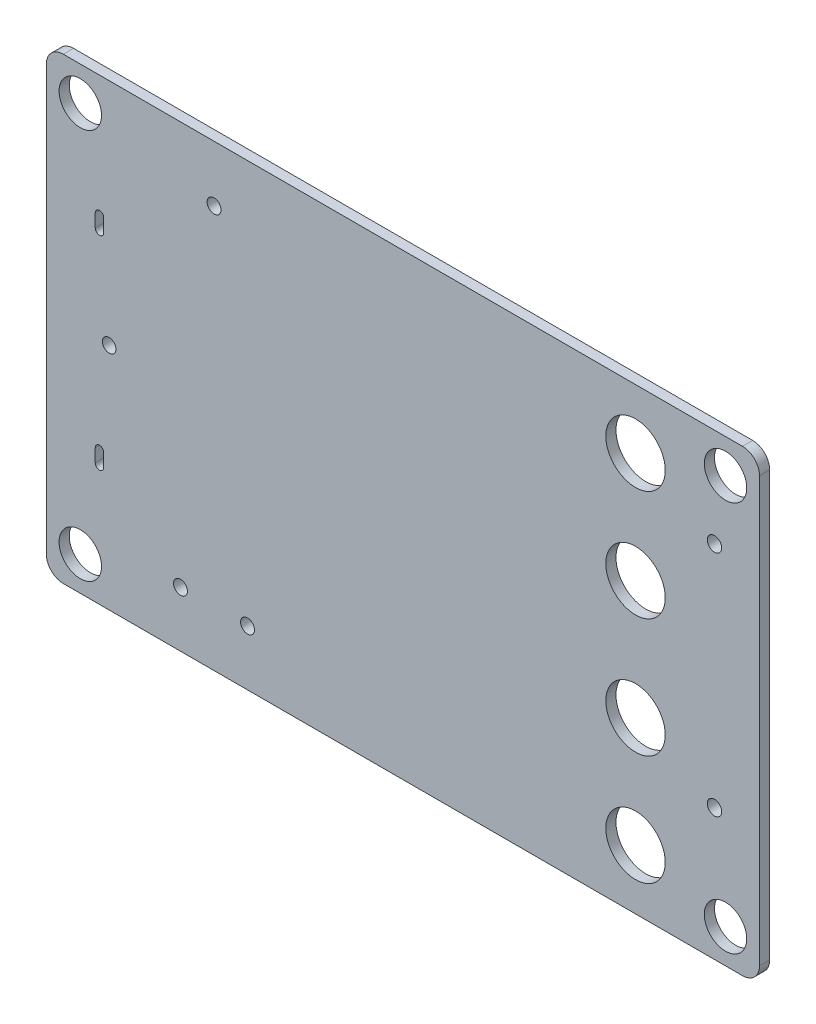
ISO-10303-21;
HEADER;
FILE_DESCRIPTION(('STEP AP214'),'2;1');
FILE_NAME('part.step','',(''),(''),'','','');
FILE_SCHEMA(('AUTOMOTIVE_DESIGN { 1 0 10303 214 1 1 1 1 }'));
ENDSEC;
DATA;
#1=APPLICATION_CONTEXT('core data for automotive mechanical design processes');
#2=APPLICATION_PROTOCOL_DEFINITION('international standard','automotive_design',2000,#1);
#3=PRODUCT_CONTEXT('',#1,'mechanical');
#4=PRODUCT('Part','Part','',(#3));
#5=PRODUCT_RELATED_PRODUCT_CATEGORY('part','',(#4));
#6=PRODUCT_DEFINITION_FORMATION('','',#4);
#7=PRODUCT_DEFINITION_CONTEXT('part definition',#1,'design');
#8=PRODUCT_DEFINITION('design','',#6,#7);
#9=PRODUCT_DEFINITION_SHAPE('','',#8);
#10=(LENGTH_UNIT() NAMED_UNIT(*) SI_UNIT(.MILLI.,.METRE.));
#11=(NAMED_UNIT(*) PLANE_ANGLE_UNIT() SI_UNIT($,.RADIAN.));
#12=(NAMED_UNIT(*) SI_UNIT($,.STERADIAN.) SOLID_ANGLE_UNIT());
#13=UNCERTAINTY_MEASURE_WITH_UNIT(LENGTH_MEASURE(1.E-05),#10,'distance_accuracy_value','');
#14=(GEOMETRIC_REPRESENTATION_CONTEXT(3) GLOBAL_UNCERTAINTY_ASSIGNED_CONTEXT((#13)) GLOBAL_UNIT_ASSIGNED_CONTEXT((#10,
#11,#12)) REPRESENTATION_CONTEXT('',''));
#15=CARTESIAN_POINT('',(0.,0.,0.));
#16=DIRECTION('',(0.,0.,1.));
#17=DIRECTION('',(1.,0.,0.));
#18=AXIS2_PLACEMENT_3D('',#15,#16,#17);
#19=CARTESIAN_POINT('',(53.34,-34.29,1.524));
#20=DIRECTION('',(-1.,0.,0.));
#21=DIRECTION('',(0.,0.,1.));
#22=AXIS2_PLACEMENT_3D('',#19,#20,#21);
#23=PLANE('',#22);
#24=DIRECTION('',(0.,1.,0.));
#25=VECTOR('',#24,1.);
#26=CARTESIAN_POINT('',(53.34,-34.29,0.));
#27=LINE('',#26,#25);
#28=CARTESIAN_POINT('',(53.34,-31.75,0.));
#29=VERTEX_POINT('',#28);
#30=CARTESIAN_POINT('',(53.34,31.75,0.));
#31=VERTEX_POINT('',#30);
#32=EDGE_CURVE('E294',#29,#31,#27,.T.);
#33=ORIENTED_EDGE('',*,*,#32,.T.);
#34=DIRECTION('',(0.,0.,-1.));
#35=VECTOR('',#34,1.);
#36=CARTESIAN_POINT('',(53.34,31.75,1.524));
#37=LINE('',#36,#35);
#38=CARTESIAN_POINT('',(53.34,31.75,1.524));
#39=VERTEX_POINT('',#38);
#40=EDGE_CURVE('E336',#31,#39,#37,.F.);
#41=ORIENTED_EDGE('',*,*,#40,.T.);
#42=DIRECTION('',(0.,1.,0.));
#43=VECTOR('',#42,1.);
#44=CARTESIAN_POINT('',(53.34,-34.29,1.524));
#45=LINE('',#44,#43);
#46=CARTESIAN_POINT('',(53.34,-31.75,1.524));
#47=VERTEX_POINT('',#46);
#48=EDGE_CURVE('E297',#47,#39,#45,.T.);
#49=ORIENTED_EDGE('',*,*,#48,.F.);
#50=DIRECTION('',(0.,0.,-1.));
#51=VECTOR('',#50,1.);
#52=CARTESIAN_POINT('',(53.34,-31.75,1.524));
#53=LINE('',#52,#51);
#54=EDGE_CURVE('E333',#47,#29,#53,.T.);
#55=ORIENTED_EDGE('',*,*,#54,.T.);
#56=EDGE_LOOP('',(#33,#41,#49,#55));
#57=FACE_BOUND('',#56,.T.);
#58=ADVANCED_FACE('F34',(#57),#23,.F.);
#59=CARTESIAN_POINT('',(-53.34,34.29,1.524));
#60=DIRECTION('',(0.,-1.,0.));
#61=DIRECTION('',(0.,0.,-1.));
#62=AXIS2_PLACEMENT_3D('',#59,#60,#61);
#63=PLANE('',#62);
#64=DIRECTION('',(-1.,0.,0.));
#65=VECTOR('',#64,1.);
#66=CARTESIAN_POINT('',(-53.34,34.29,1.524));
#67=LINE('',#66,#65);
#68=CARTESIAN_POINT('',(50.8,34.29,1.524));
#69=VERTEX_POINT('',#68);
#70=CARTESIAN_POINT('',(-50.8,34.29,1.524));
#71=VERTEX_POINT('',#70);
#72=EDGE_CURVE('E300',#69,#71,#67,.T.);
#73=ORIENTED_EDGE('',*,*,#72,.F.);
#74=DIRECTION('',(0.,0.,-1.));
#75=VECTOR('',#74,1.);
#76=CARTESIAN_POINT('',(50.8,34.29,1.524));
#77=LINE('',#76,#75);
#78=CARTESIAN_POINT('',(50.8,34.29,0.));
#79=VERTEX_POINT('',#78);
#80=EDGE_CURVE('E322',#69,#79,#77,.T.);
#81=ORIENTED_EDGE('',*,*,#80,.T.);
#82=DIRECTION('',(-1.,0.,0.));
#83=VECTOR('',#82,1.);
#84=CARTESIAN_POINT('',(-53.34,34.29,0.));
#85=LINE('',#84,#83);
#86=CARTESIAN_POINT('',(-50.8,34.29,0.));
#87=VERTEX_POINT('',#86);
#88=EDGE_CURVE('E313',#79,#87,#85,.T.);
#89=ORIENTED_EDGE('',*,*,#88,.T.);
#90=DIRECTION('',(0.,0.,-1.));
#91=VECTOR('',#90,1.);
#92=CARTESIAN_POINT('',(-50.8,34.29,1.524));
#93=LINE('',#92,#91);
#94=EDGE_CURVE('E310',#87,#71,#93,.F.);
#95=ORIENTED_EDGE('',*,*,#94,.T.);
#96=EDGE_LOOP('',(#73,#81,#89,#95));
#97=FACE_BOUND('',#96,.T.);
#98=ADVANCED_FACE('F386',(#97),#63,.F.);
#99=CARTESIAN_POINT('',(-53.34,-34.29,1.524));
#100=DIRECTION('',(1.,0.,0.));
#101=DIRECTION('',(0.,0.,-1.));
#102=AXIS2_PLACEMENT_3D('',#99,#100,#101);
#103=PLANE('',#102);
#104=DIRECTION('',(0.,-1.,0.));
#105=VECTOR('',#104,1.);
#106=CARTESIAN_POINT('',(-53.34,-34.29,0.));
#107=LINE('',#106,#105);
#108=CARTESIAN_POINT('',(-53.34,31.75,0.));
#109=VERTEX_POINT('',#108);
#110=CARTESIAN_POINT('',(-53.34,-31.75,0.));
#111=VERTEX_POINT('',#110);
#112=EDGE_CURVE('E316',#109,#111,#107,.T.);
#113=ORIENTED_EDGE('',*,*,#112,.T.);
#114=DIRECTION('',(0.,0.,-1.));
#115=VECTOR('',#114,1.);
#116=CARTESIAN_POINT('',(-53.34,-31.75,1.524));
#117=LINE('',#116,#115);
#118=CARTESIAN_POINT('',(-53.34,-31.75,1.524));
#119=VERTEX_POINT('',#118);
#120=EDGE_CURVE('E11',#111,#119,#117,.F.);
#121=ORIENTED_EDGE('',*,*,#120,.T.);
#122=DIRECTION('',(0.,-1.,0.));
#123=VECTOR('',#122,1.);
#124=CARTESIAN_POINT('',(-53.34,-34.29,1.524));
#125=LINE('',#124,#123);
#126=CARTESIAN_POINT('',(-53.34,31.75,1.524));
#127=VERTEX_POINT('',#126);
#128=EDGE_CURVE('E304',#127,#119,#125,.T.);
#129=ORIENTED_EDGE('',*,*,#128,.F.);
#130=DIRECTION('',(0.,0.,-1.));
#131=VECTOR('',#130,1.);
#132=CARTESIAN_POINT('',(-53.34,31.75,1.524));
#133=LINE('',#132,#131);
#134=EDGE_CURVE('E42',#127,#109,#133,.T.);
#135=ORIENTED_EDGE('',*,*,#134,.T.);
#136=EDGE_LOOP('',(#113,#121,#129,#135));
#137=FACE_BOUND('',#136,.T.);
#138=ADVANCED_FACE('F355',(#137),#103,.F.);
#139=CARTESIAN_POINT('',(-53.34,-34.29,1.524));
#140=DIRECTION('',(0.,1.,0.));
#141=DIRECTION('',(0.,0.,1.));
#142=AXIS2_PLACEMENT_3D('',#139,#140,#141);
#143=PLANE('',#142);
#144=DIRECTION('',(1.,0.,0.));
#145=VECTOR('',#144,1.);
#146=CARTESIAN_POINT('',(-53.34,-34.29,0.));
#147=LINE('',#146,#145);
#148=CARTESIAN_POINT('',(-50.8,-34.29,0.));
#149=VERTEX_POINT('',#148);
#150=CARTESIAN_POINT('',(50.8,-34.29,0.));
#151=VERTEX_POINT('',#150);
#152=EDGE_CURVE('E301',#149,#151,#147,.T.);
#153=ORIENTED_EDGE('',*,*,#152,.T.);
#154=DIRECTION('',(0.,0.,-1.));
#155=VECTOR('',#154,1.);
#156=CARTESIAN_POINT('',(50.8,-34.29,1.524));
#157=LINE('',#156,#155);
#158=CARTESIAN_POINT('',(50.8,-34.29,1.524));
#159=VERTEX_POINT('',#158);
#160=EDGE_CURVE('E349',#151,#159,#157,.F.);
#161=ORIENTED_EDGE('',*,*,#160,.T.);
#162=DIRECTION('',(1.,0.,0.));
#163=VECTOR('',#162,1.);
#164=CARTESIAN_POINT('',(-53.34,-34.29,1.524));
#165=LINE('',#164,#163);
#166=CARTESIAN_POINT('',(-50.8,-34.29,1.524));
#167=VERTEX_POINT('',#166);
#168=EDGE_CURVE('E307',#167,#159,#165,.T.);
#169=ORIENTED_EDGE('',*,*,#168,.F.);
#170=DIRECTION('',(0.,0.,-1.));
#171=VECTOR('',#170,1.);
#172=CARTESIAN_POINT('',(-50.8,-34.29,1.524));
#173=LINE('',#172,#171);
#174=EDGE_CURVE('E346',#167,#149,#173,.T.);
#175=ORIENTED_EDGE('',*,*,#174,.T.);
#176=EDGE_LOOP('',(#153,#161,#169,#175));
#177=FACE_BOUND('',#176,.T.);
#178=ADVANCED_FACE('F368',(#177),#143,.F.);
#179=CARTESIAN_POINT('',(53.34,34.29,1.524));
#180=DIRECTION('',(0.,0.,-1.));
#181=DIRECTION('',(-1.,0.,0.));
#182=AXIS2_PLACEMENT_3D('',#179,#180,#181);
#183=PLANE('',#182);
#184=DIRECTION('',(0.,-1.,0.));
#185=VECTOR('',#184,1.);
#186=CARTESIAN_POINT('',(-46.0248,-14.3002,1.524));
#187=LINE('',#186,#185);
#188=CARTESIAN_POINT('',(-46.0248,-14.3002,1.524));
#189=VERTEX_POINT('',#188);
#190=CARTESIAN_POINT('',(-46.0248,-16.256,1.524));
#191=VERTEX_POINT('',#190);
#192=EDGE_CURVE('E165',#189,#191,#187,.T.);
#193=ORIENTED_EDGE('',*,*,#192,.F.);
#194=CARTESIAN_POINT('',(-45.3898,-14.3002,1.524));
#195=DIRECTION('',(0.,0.,1.));
#196=DIRECTION('',(1.,0.,0.));
#197=AXIS2_PLACEMENT_3D('',#194,#195,#196);
#198=CIRCLE('',#197,0.634999999999997);
#199=CARTESIAN_POINT('',(-44.7548,-14.3002,1.524));
#200=VERTEX_POINT('',#199);
#201=EDGE_CURVE('E49',#200,#189,#198,.T.);
#202=ORIENTED_EDGE('',*,*,#201,.F.);
#203=DIRECTION('',(0.,1.,0.));
#204=VECTOR('',#203,1.);
#205=CARTESIAN_POINT('',(-44.7548,-14.3002,1.524));
#206=LINE('',#205,#204);
#207=CARTESIAN_POINT('',(-44.7548,-16.256,1.524));
#208=VERTEX_POINT('',#207);
#209=EDGE_CURVE('E158',#208,#200,#206,.T.);
#210=ORIENTED_EDGE('',*,*,#209,.F.);
#211=CARTESIAN_POINT('',(-45.3898,-16.256,1.524));
#212=DIRECTION('',(0.,0.,1.));
#213=DIRECTION('',(1.,0.,0.));
#214=AXIS2_PLACEMENT_3D('',#211,#212,#213);
#215=CIRCLE('',#214,0.634999999999997);
#216=EDGE_CURVE('E172',#191,#208,#215,.T.);
#217=ORIENTED_EDGE('',*,*,#216,.F.);
#218=EDGE_LOOP('',(#193,#202,#210,#217));
#219=FACE_BOUND('',#218,.T.);
#220=DIRECTION('',(0.,-1.,0.));
#221=VECTOR('',#220,1.);
#222=CARTESIAN_POINT('',(-46.0248,16.129,1.524));
#223=LINE('',#222,#221);
#224=CARTESIAN_POINT('',(-46.0248,16.129,1.524));
#225=VERTEX_POINT('',#224);
#226=CARTESIAN_POINT('',(-46.0248,14.1732,1.524));
#227=VERTEX_POINT('',#226);
#228=EDGE_CURVE('E191',#225,#227,#223,.T.);
#229=ORIENTED_EDGE('',*,*,#228,.F.);
#230=CARTESIAN_POINT('',(-45.3898,16.129,1.524));
#231=DIRECTION('',(0.,0.,1.));
#232=DIRECTION('',(1.,0.,0.));
#233=AXIS2_PLACEMENT_3D('',#230,#231,#232);
#234=CIRCLE('',#233,0.634999999999997);
#235=CARTESIAN_POINT('',(-44.7548,16.129,1.524));
#236=VERTEX_POINT('',#235);
#237=EDGE_CURVE('E189',#236,#225,#234,.T.);
#238=ORIENTED_EDGE('',*,*,#237,.F.);
#239=DIRECTION('',(0.,1.,0.));
#240=VECTOR('',#239,1.);
#241=CARTESIAN_POINT('',(-44.7548,16.129,1.524));
#242=LINE('',#241,#240);
#243=CARTESIAN_POINT('',(-44.7548,14.1732,1.524));
#244=VERTEX_POINT('',#243);
#245=EDGE_CURVE('E197',#244,#236,#242,.T.);
#246=ORIENTED_EDGE('',*,*,#245,.F.);
#247=CARTESIAN_POINT('',(-45.3898,14.1732,1.524));
#248=DIRECTION('',(0.,0.,1.));
#249=DIRECTION('',(1.,0.,0.));
#250=AXIS2_PLACEMENT_3D('',#247,#248,#249);
#251=CIRCLE('',#250,0.634999999999997);
#252=EDGE_CURVE('E194',#227,#244,#251,.T.);
#253=ORIENTED_EDGE('',*,*,#252,.F.);
#254=EDGE_LOOP('',(#229,#238,#246,#253));
#255=FACE_BOUND('',#254,.T.);
#256=CARTESIAN_POINT('',(-43.942,0.,1.524));
#257=DIRECTION('',(0.,0.,1.));
#258=DIRECTION('',(1.,0.,0.));
#259=AXIS2_PLACEMENT_3D('',#256,#257,#258);
#260=CIRCLE('',#259,1.016);
#261=CARTESIAN_POINT('',(-42.926,0.,1.524));
#262=VERTEX_POINT('',#261);
#263=EDGE_CURVE('E213',#262,#262,#260,.T.);
#264=ORIENTED_EDGE('',*,*,#263,.F.);
#265=EDGE_LOOP('',(#264));
#266=FACE_BOUND('',#265,.T.);
#267=CARTESIAN_POINT('',(46.609,-14.605,1.524));
#268=DIRECTION('',(0.,0.,1.));
#269=DIRECTION('',(1.,0.,0.));
#270=AXIS2_PLACEMENT_3D('',#267,#268,#269);
#271=CIRCLE('',#270,1.0795);
#272=CARTESIAN_POINT('',(47.6885,-14.605,1.524));
#273=VERTEX_POINT('',#272);
#274=EDGE_CURVE('E219',#273,#273,#271,.T.);
#275=ORIENTED_EDGE('',*,*,#274,.F.);
#276=EDGE_LOOP('',(#275));
#277=FACE_BOUND('',#276,.T.);
#278=CARTESIAN_POINT('',(46.609,19.558,1.524));
#279=DIRECTION('',(0.,0.,1.));
#280=DIRECTION('',(1.,0.,0.));
#281=AXIS2_PLACEMENT_3D('',#278,#279,#280);
#282=CIRCLE('',#281,1.0795);
#283=CARTESIAN_POINT('',(47.6885,19.558,1.524));
#284=VERTEX_POINT('',#283);
#285=EDGE_CURVE('E225',#284,#284,#282,.T.);
#286=ORIENTED_EDGE('',*,*,#285,.F.);
#287=EDGE_LOOP('',(#286));
#288=FACE_BOUND('',#287,.T.);
#289=CARTESIAN_POINT('',(-28.2448,25.908,1.524));
#290=DIRECTION('',(0.,0.,1.));
#291=DIRECTION('',(1.,0.,0.));
#292=AXIS2_PLACEMENT_3D('',#289,#290,#291);
#293=CIRCLE('',#292,1.0414);
#294=CARTESIAN_POINT('',(-27.2034,25.908,1.524));
#295=VERTEX_POINT('',#294);
#296=EDGE_CURVE('E231',#295,#295,#293,.T.);
#297=ORIENTED_EDGE('',*,*,#296,.F.);
#298=EDGE_LOOP('',(#297));
#299=FACE_BOUND('',#298,.T.);
#300=CARTESIAN_POINT('',(-33.274,-26.0096,1.524));
#301=DIRECTION('',(0.,0.,1.));
#302=DIRECTION('',(1.,0.,0.));
#303=AXIS2_PLACEMENT_3D('',#300,#301,#302);
#304=CIRCLE('',#303,1.0414);
#305=CARTESIAN_POINT('',(-32.2326,-26.0096,1.524));
#306=VERTEX_POINT('',#305);
#307=EDGE_CURVE('E237',#306,#306,#304,.T.);
#308=ORIENTED_EDGE('',*,*,#307,.F.);
#309=EDGE_LOOP('',(#308));
#310=FACE_BOUND('',#309,.T.);
#311=CARTESIAN_POINT('',(-23.241,-26.0096,1.524));
#312=DIRECTION('',(0.,0.,1.));
#313=DIRECTION('',(1.,0.,0.));
#314=AXIS2_PLACEMENT_3D('',#311,#312,#313);
#315=CIRCLE('',#314,1.0414);
#316=CARTESIAN_POINT('',(-22.1996,-26.0096,1.524));
#317=VERTEX_POINT('',#316);
#318=EDGE_CURVE('E243',#317,#317,#315,.T.);
#319=ORIENTED_EDGE('',*,*,#318,.F.);
#320=EDGE_LOOP('',(#319));
#321=FACE_BOUND('',#320,.T.);
#322=CARTESIAN_POINT('',(34.798,25.4,1.524));
#323=DIRECTION('',(0.,0.,1.));
#324=DIRECTION('',(1.,0.,0.));
#325=AXIS2_PLACEMENT_3D('',#322,#323,#324);
#326=CIRCLE('',#325,4.44499999999999);
#327=CARTESIAN_POINT('',(39.243,25.4,1.524));
#328=VERTEX_POINT('',#327);
#329=EDGE_CURVE('E249',#328,#328,#326,.T.);
#330=ORIENTED_EDGE('',*,*,#329,.F.);
#331=EDGE_LOOP('',(#330));
#332=FACE_BOUND('',#331,.T.);
#333=CARTESIAN_POINT('',(34.798,8.88999999999999,1.524));
#334=DIRECTION('',(0.,0.,1.));
#335=DIRECTION('',(1.,0.,0.));
#336=AXIS2_PLACEMENT_3D('',#333,#334,#335);
#337=CIRCLE('',#336,4.445);
#338=CARTESIAN_POINT('',(39.243,8.88999999999999,1.524));
#339=VERTEX_POINT('',#338);
#340=EDGE_CURVE('E255',#339,#339,#337,.T.);
#341=ORIENTED_EDGE('',*,*,#340,.F.);
#342=EDGE_LOOP('',(#341));
#343=FACE_BOUND('',#342,.T.);
#344=CARTESIAN_POINT('',(34.798,-8.89000000000001,1.524));
#345=DIRECTION('',(0.,0.,1.));
#346=DIRECTION('',(1.,0.,0.));
#347=AXIS2_PLACEMENT_3D('',#344,#345,#346);
#348=CIRCLE('',#347,4.445);
#349=CARTESIAN_POINT('',(39.243,-8.89000000000001,1.524));
#350=VERTEX_POINT('',#349);
#351=EDGE_CURVE('E261',#350,#350,#348,.T.);
#352=ORIENTED_EDGE('',*,*,#351,.F.);
#353=EDGE_LOOP('',(#352));
#354=FACE_BOUND('',#353,.T.);
#355=CARTESIAN_POINT('',(34.798,-25.4,1.524));
#356=DIRECTION('',(0.,0.,1.));
#357=DIRECTION('',(1.,0.,0.));
#358=AXIS2_PLACEMENT_3D('',#355,#356,#357);
#359=CIRCLE('',#358,4.44499999999999);
#360=CARTESIAN_POINT('',(39.243,-25.4,1.524));
#361=VERTEX_POINT('',#360);
#362=EDGE_CURVE('E267',#361,#361,#359,.T.);
#363=ORIENTED_EDGE('',*,*,#362,.F.);
#364=EDGE_LOOP('',(#363));
#365=FACE_BOUND('',#364,.T.);
#366=CARTESIAN_POINT('',(48.26,29.21,1.524));
#367=DIRECTION('',(0.,0.,1.));
#368=DIRECTION('',(1.,0.,0.));
#369=AXIS2_PLACEMENT_3D('',#366,#367,#368);
#370=CIRCLE('',#369,3.175);
#371=CARTESIAN_POINT('',(51.435,29.21,1.524));
#372=VERTEX_POINT('',#371);
#373=EDGE_CURVE('E273',#372,#372,#370,.T.);
#374=ORIENTED_EDGE('',*,*,#373,.F.);
#375=EDGE_LOOP('',(#374));
#376=FACE_BOUND('',#375,.T.);
#377=CARTESIAN_POINT('',(48.26,-29.21,1.524));
#378=DIRECTION('',(0.,0.,1.));
#379=DIRECTION('',(1.,0.,0.));
#380=AXIS2_PLACEMENT_3D('',#377,#378,#379);
#381=CIRCLE('',#380,3.175);
#382=CARTESIAN_POINT('',(51.435,-29.21,1.524));
#383=VERTEX_POINT('',#382);
#384=EDGE_CURVE('E279',#383,#383,#381,.T.);
#385=ORIENTED_EDGE('',*,*,#384,.F.);
#386=EDGE_LOOP('',(#385));
#387=FACE_BOUND('',#386,.T.);
#388=CARTESIAN_POINT('',(-48.26,-29.21,1.524));
#389=DIRECTION('',(0.,0.,1.));
#390=DIRECTION('',(1.,0.,0.));
#391=AXIS2_PLACEMENT_3D('',#388,#389,#390);
#392=CIRCLE('',#391,3.175);
#393=CARTESIAN_POINT('',(-45.085,-29.21,1.524));
#394=VERTEX_POINT('',#393);
#395=EDGE_CURVE('E285',#394,#394,#392,.T.);
#396=ORIENTED_EDGE('',*,*,#395,.F.);
#397=EDGE_LOOP('',(#396));
#398=FACE_BOUND('',#397,.T.);
#399=CARTESIAN_POINT('',(-48.26,29.21,1.524));
#400=DIRECTION('',(0.,0.,1.));
#401=DIRECTION('',(1.,0.,0.));
#402=AXIS2_PLACEMENT_3D('',#399,#400,#401);
#403=CIRCLE('',#402,3.175);
#404=CARTESIAN_POINT('',(-45.085,29.21,1.524));
#405=VERTEX_POINT('',#404);
#406=EDGE_CURVE('E291',#405,#405,#403,.T.);
#407=ORIENTED_EDGE('',*,*,#406,.F.);
#408=EDGE_LOOP('',(#407));
#409=FACE_BOUND('',#408,.T.);
#410=ORIENTED_EDGE('',*,*,#48,.T.);
#411=CARTESIAN_POINT('',(50.8,31.75,1.524));
#412=DIRECTION('',(0.,0.,-1.));
#413=DIRECTION('',(-1.,0.,0.));
#414=AXIS2_PLACEMENT_3D('',#411,#412,#413);
#415=CIRCLE('',#414,2.54);
#416=EDGE_CURVE('E344',#39,#69,#415,.F.);
#417=ORIENTED_EDGE('',*,*,#416,.T.);
#418=ORIENTED_EDGE('',*,*,#72,.T.);
#419=CARTESIAN_POINT('',(-50.8,31.75,1.524));
#420=DIRECTION('',(0.,0.,-1.));
#421=DIRECTION('',(-1.,0.,0.));
#422=AXIS2_PLACEMENT_3D('',#419,#420,#421);
#423=CIRCLE('',#422,2.54);
#424=EDGE_CURVE('E338',#71,#127,#423,.F.);
#425=ORIENTED_EDGE('',*,*,#424,.T.);
#426=ORIENTED_EDGE('',*,*,#128,.T.);
#427=CARTESIAN_POINT('',(-50.8,-31.75,1.524));
#428=DIRECTION('',(0.,0.,-1.));
#429=DIRECTION('',(-1.,0.,0.));
#430=AXIS2_PLACEMENT_3D('',#427,#428,#429);
#431=CIRCLE('',#430,2.54);
#432=EDGE_CURVE('E340',#119,#167,#431,.F.);
#433=ORIENTED_EDGE('',*,*,#432,.T.);
#434=ORIENTED_EDGE('',*,*,#168,.T.);
#435=CARTESIAN_POINT('',(50.8,-31.75,1.524));
#436=DIRECTION('',(0.,0.,-1.));
#437=DIRECTION('',(-1.,0.,0.));
#438=AXIS2_PLACEMENT_3D('',#435,#436,#437);
#439=CIRCLE('',#438,2.54);
#440=EDGE_CURVE('E342',#159,#47,#439,.F.);
#441=ORIENTED_EDGE('',*,*,#440,.T.);
#442=EDGE_LOOP('',(#410,#417,#418,#425,#426,#433,#434,#441));
#443=FACE_BOUND('',#442,.T.);
#444=ADVANCED_FACE('F372',(#219,#255,#266,#277,#288,#299,#310,#321,#332,#343,#354,#365,#376,
#387,#398,#409,#443),#183,.F.);
#445=CARTESIAN_POINT('',(53.34,34.29,0.));
#446=DIRECTION('',(0.,0.,-1.));
#447=DIRECTION('',(-1.,0.,0.));
#448=AXIS2_PLACEMENT_3D('',#445,#446,#447);
#449=PLANE('',#448);
#450=CARTESIAN_POINT('',(-45.3898,-14.3002,0.));
#451=DIRECTION('',(0.,0.,-1.));
#452=DIRECTION('',(-1.,0.,0.));
#453=AXIS2_PLACEMENT_3D('',#450,#451,#452);
#454=CIRCLE('',#453,0.634999999999997);
#455=CARTESIAN_POINT('',(-44.7548,-14.3002,0.));
#456=VERTEX_POINT('',#455);
#457=CARTESIAN_POINT('',(-46.0248,-14.3002,0.));
#458=VERTEX_POINT('',#457);
#459=EDGE_CURVE('E156',#456,#458,#454,.F.);
#460=ORIENTED_EDGE('',*,*,#459,.T.);
#461=DIRECTION('',(0.,-1.,0.));
#462=VECTOR('',#461,1.);
#463=CARTESIAN_POINT('',(-46.0248,-14.3002,0.));
#464=LINE('',#463,#462);
#465=CARTESIAN_POINT('',(-46.0248,-16.256,0.));
#466=VERTEX_POINT('',#465);
#467=EDGE_CURVE('E145',#458,#466,#464,.T.);
#468=ORIENTED_EDGE('',*,*,#467,.T.);
#469=CARTESIAN_POINT('',(-45.3898,-16.256,0.));
#470=DIRECTION('',(0.,0.,-1.));
#471=DIRECTION('',(-1.,0.,0.));
#472=AXIS2_PLACEMENT_3D('',#469,#470,#471);
#473=CIRCLE('',#472,0.634999999999997);
#474=CARTESIAN_POINT('',(-44.7548,-16.256,0.));
#475=VERTEX_POINT('',#474);
#476=EDGE_CURVE('E167',#466,#475,#473,.F.);
#477=ORIENTED_EDGE('',*,*,#476,.T.);
#478=DIRECTION('',(0.,1.,0.));
#479=VECTOR('',#478,1.);
#480=CARTESIAN_POINT('',(-44.7548,-14.3002,0.));
#481=LINE('',#480,#479);
#482=EDGE_CURVE('E163',#475,#456,#481,.T.);
#483=ORIENTED_EDGE('',*,*,#482,.T.);
#484=EDGE_LOOP('',(#460,#468,#477,#483));
#485=FACE_BOUND('',#484,.T.);
#486=CARTESIAN_POINT('',(-45.3898,16.129,0.));
#487=DIRECTION('',(0.,0.,-1.));
#488=DIRECTION('',(-1.,0.,0.));
#489=AXIS2_PLACEMENT_3D('',#486,#487,#488);
#490=CIRCLE('',#489,0.634999999999997);
#491=CARTESIAN_POINT('',(-44.7548,16.129,0.));
#492=VERTEX_POINT('',#491);
#493=CARTESIAN_POINT('',(-46.0248,16.129,0.));
#494=VERTEX_POINT('',#493);
#495=EDGE_CURVE('E186',#492,#494,#490,.F.);
#496=ORIENTED_EDGE('',*,*,#495,.T.);
#497=DIRECTION('',(0.,-1.,0.));
#498=VECTOR('',#497,1.);
#499=CARTESIAN_POINT('',(-46.0248,16.129,0.));
#500=LINE('',#499,#498);
#501=CARTESIAN_POINT('',(-46.0248,14.1732,0.));
#502=VERTEX_POINT('',#501);
#503=EDGE_CURVE('E203',#494,#502,#500,.T.);
#504=ORIENTED_EDGE('',*,*,#503,.T.);
#505=CARTESIAN_POINT('',(-45.3898,14.1732,0.));
#506=DIRECTION('',(0.,0.,-1.));
#507=DIRECTION('',(-1.,0.,0.));
#508=AXIS2_PLACEMENT_3D('',#505,#506,#507);
#509=CIRCLE('',#508,0.634999999999997);
#510=CARTESIAN_POINT('',(-44.7548,14.1732,0.));
#511=VERTEX_POINT('',#510);
#512=EDGE_CURVE('E152',#502,#511,#509,.F.);
#513=ORIENTED_EDGE('',*,*,#512,.T.);
#514=DIRECTION('',(0.,1.,0.));
#515=VECTOR('',#514,1.);
#516=CARTESIAN_POINT('',(-44.7548,16.129,0.));
#517=LINE('',#516,#515);
#518=EDGE_CURVE('E183',#511,#492,#517,.T.);
#519=ORIENTED_EDGE('',*,*,#518,.T.);
#520=EDGE_LOOP('',(#496,#504,#513,#519));
#521=FACE_BOUND('',#520,.T.);
#522=CARTESIAN_POINT('',(-43.942,0.,0.));
#523=DIRECTION('',(0.,0.,-1.));
#524=DIRECTION('',(-1.,0.,0.));
#525=AXIS2_PLACEMENT_3D('',#522,#523,#524);
#526=CIRCLE('',#525,1.016);
#527=CARTESIAN_POINT('',(-44.958,0.,0.));
#528=VERTEX_POINT('',#527);
#529=EDGE_CURVE('E212',#528,#528,#526,.F.);
#530=ORIENTED_EDGE('',*,*,#529,.T.);
#531=EDGE_LOOP('',(#530));
#532=FACE_BOUND('',#531,.T.);
#533=CARTESIAN_POINT('',(46.609,-14.605,0.));
#534=DIRECTION('',(0.,0.,-1.));
#535=DIRECTION('',(-1.,0.,0.));
#536=AXIS2_PLACEMENT_3D('',#533,#534,#535);
#537=CIRCLE('',#536,1.0795);
#538=CARTESIAN_POINT('',(45.5295,-14.605,0.));
#539=VERTEX_POINT('',#538);
#540=EDGE_CURVE('E216',#539,#539,#537,.F.);
#541=ORIENTED_EDGE('',*,*,#540,.T.);
#542=EDGE_LOOP('',(#541));
#543=FACE_BOUND('',#542,.T.);
#544=CARTESIAN_POINT('',(46.609,19.558,0.));
#545=DIRECTION('',(0.,0.,-1.));
#546=DIRECTION('',(-1.,0.,0.));
#547=AXIS2_PLACEMENT_3D('',#544,#545,#546);
#548=CIRCLE('',#547,1.0795);
#549=CARTESIAN_POINT('',(45.5295,19.558,0.));
#550=VERTEX_POINT('',#549);
#551=EDGE_CURVE('E222',#550,#550,#548,.F.);
#552=ORIENTED_EDGE('',*,*,#551,.T.);
#553=EDGE_LOOP('',(#552));
#554=FACE_BOUND('',#553,.T.);
#555=CARTESIAN_POINT('',(-28.2448,25.908,0.));
#556=DIRECTION('',(0.,0.,-1.));
#557=DIRECTION('',(-1.,0.,0.));
#558=AXIS2_PLACEMENT_3D('',#555,#556,#557);
#559=CIRCLE('',#558,1.0414);
#560=CARTESIAN_POINT('',(-29.2862,25.908,0.));
#561=VERTEX_POINT('',#560);
#562=EDGE_CURVE('E228',#561,#561,#559,.F.);
#563=ORIENTED_EDGE('',*,*,#562,.T.);
#564=EDGE_LOOP('',(#563));
#565=FACE_BOUND('',#564,.T.);
#566=CARTESIAN_POINT('',(-33.274,-26.0096,0.));
#567=DIRECTION('',(0.,0.,-1.));
#568=DIRECTION('',(-1.,0.,0.));
#569=AXIS2_PLACEMENT_3D('',#566,#567,#568);
#570=CIRCLE('',#569,1.0414);
#571=CARTESIAN_POINT('',(-34.3154,-26.0096,0.));
#572=VERTEX_POINT('',#571);
#573=EDGE_CURVE('E234',#572,#572,#570,.F.);
#574=ORIENTED_EDGE('',*,*,#573,.T.);
#575=EDGE_LOOP('',(#574));
#576=FACE_BOUND('',#575,.T.);
#577=CARTESIAN_POINT('',(-23.241,-26.0096,0.));
#578=DIRECTION('',(0.,0.,-1.));
#579=DIRECTION('',(-1.,0.,0.));
#580=AXIS2_PLACEMENT_3D('',#577,#578,#579);
#581=CIRCLE('',#580,1.0414);
#582=CARTESIAN_POINT('',(-24.2824,-26.0096,0.));
#583=VERTEX_POINT('',#582);
#584=EDGE_CURVE('E240',#583,#583,#581,.F.);
#585=ORIENTED_EDGE('',*,*,#584,.T.);
#586=EDGE_LOOP('',(#585));
#587=FACE_BOUND('',#586,.T.);
#588=CARTESIAN_POINT('',(34.798,25.4,0.));
#589=DIRECTION('',(0.,0.,-1.));
#590=DIRECTION('',(-1.,0.,0.));
#591=AXIS2_PLACEMENT_3D('',#588,#589,#590);
#592=CIRCLE('',#591,4.44499999999999);
#593=CARTESIAN_POINT('',(30.353,25.4,0.));
#594=VERTEX_POINT('',#593);
#595=EDGE_CURVE('E246',#594,#594,#592,.F.);
#596=ORIENTED_EDGE('',*,*,#595,.T.);
#597=EDGE_LOOP('',(#596));
#598=FACE_BOUND('',#597,.T.);
#599=CARTESIAN_POINT('',(34.798,8.88999999999999,0.));
#600=DIRECTION('',(0.,0.,-1.));
#601=DIRECTION('',(-1.,0.,0.));
#602=AXIS2_PLACEMENT_3D('',#599,#600,#601);
#603=CIRCLE('',#602,4.445);
#604=CARTESIAN_POINT('',(30.353,8.88999999999999,0.));
#605=VERTEX_POINT('',#604);
#606=EDGE_CURVE('E252',#605,#605,#603,.F.);
#607=ORIENTED_EDGE('',*,*,#606,.T.);
#608=EDGE_LOOP('',(#607));
#609=FACE_BOUND('',#608,.T.);
#610=CARTESIAN_POINT('',(34.798,-8.89000000000001,0.));
#611=DIRECTION('',(0.,0.,-1.));
#612=DIRECTION('',(-1.,0.,0.));
#613=AXIS2_PLACEMENT_3D('',#610,#611,#612);
#614=CIRCLE('',#613,4.445);
#615=CARTESIAN_POINT('',(30.353,-8.89000000000001,0.));
#616=VERTEX_POINT('',#615);
#617=EDGE_CURVE('E258',#616,#616,#614,.F.);
#618=ORIENTED_EDGE('',*,*,#617,.T.);
#619=EDGE_LOOP('',(#618));
#620=FACE_BOUND('',#619,.T.);
#621=CARTESIAN_POINT('',(34.798,-25.4,0.));
#622=DIRECTION('',(0.,0.,-1.));
#623=DIRECTION('',(-1.,0.,0.));
#624=AXIS2_PLACEMENT_3D('',#621,#622,#623);
#625=CIRCLE('',#624,4.44499999999999);
#626=CARTESIAN_POINT('',(30.353,-25.4,0.));
#627=VERTEX_POINT('',#626);
#628=EDGE_CURVE('E264',#627,#627,#625,.F.);
#629=ORIENTED_EDGE('',*,*,#628,.T.);
#630=EDGE_LOOP('',(#629));
#631=FACE_BOUND('',#630,.T.);
#632=CARTESIAN_POINT('',(48.26,29.21,0.));
#633=DIRECTION('',(0.,0.,-1.));
#634=DIRECTION('',(-1.,0.,0.));
#635=AXIS2_PLACEMENT_3D('',#632,#633,#634);
#636=CIRCLE('',#635,3.175);
#637=CARTESIAN_POINT('',(45.085,29.21,0.));
#638=VERTEX_POINT('',#637);
#639=EDGE_CURVE('E270',#638,#638,#636,.F.);
#640=ORIENTED_EDGE('',*,*,#639,.T.);
#641=EDGE_LOOP('',(#640));
#642=FACE_BOUND('',#641,.T.);
#643=CARTESIAN_POINT('',(48.26,-29.21,0.));
#644=DIRECTION('',(0.,0.,-1.));
#645=DIRECTION('',(-1.,0.,0.));
#646=AXIS2_PLACEMENT_3D('',#643,#644,#645);
#647=CIRCLE('',#646,3.175);
#648=CARTESIAN_POINT('',(45.085,-29.21,0.));
#649=VERTEX_POINT('',#648);
#650=EDGE_CURVE('E276',#649,#649,#647,.F.);
#651=ORIENTED_EDGE('',*,*,#650,.T.);
#652=EDGE_LOOP('',(#651));
#653=FACE_BOUND('',#652,.T.);
#654=CARTESIAN_POINT('',(-48.26,-29.21,0.));
#655=DIRECTION('',(0.,0.,-1.));
#656=DIRECTION('',(-1.,0.,0.));
#657=AXIS2_PLACEMENT_3D('',#654,#655,#656);
#658=CIRCLE('',#657,3.175);
#659=CARTESIAN_POINT('',(-51.435,-29.21,0.));
#660=VERTEX_POINT('',#659);
#661=EDGE_CURVE('E282',#660,#660,#658,.F.);
#662=ORIENTED_EDGE('',*,*,#661,.T.);
#663=EDGE_LOOP('',(#662));
#664=FACE_BOUND('',#663,.T.);
#665=CARTESIAN_POINT('',(-48.26,29.21,0.));
#666=DIRECTION('',(0.,0.,-1.));
#667=DIRECTION('',(-1.,0.,0.));
#668=AXIS2_PLACEMENT_3D('',#665,#666,#667);
#669=CIRCLE('',#668,3.175);
#670=CARTESIAN_POINT('',(-51.435,29.21,0.));
#671=VERTEX_POINT('',#670);
#672=EDGE_CURVE('E288',#671,#671,#669,.F.);
#673=ORIENTED_EDGE('',*,*,#672,.T.);
#674=EDGE_LOOP('',(#673));
#675=FACE_BOUND('',#674,.T.);
#676=ORIENTED_EDGE('',*,*,#88,.F.);
#677=CARTESIAN_POINT('',(50.8,31.75,0.));
#678=DIRECTION('',(0.,0.,-1.));
#679=DIRECTION('',(-1.,0.,0.));
#680=AXIS2_PLACEMENT_3D('',#677,#678,#679);
#681=CIRCLE('',#680,2.54);
#682=EDGE_CURVE('E331',#79,#31,#681,.T.);
#683=ORIENTED_EDGE('',*,*,#682,.T.);
#684=ORIENTED_EDGE('',*,*,#32,.F.);
#685=CARTESIAN_POINT('',(50.8,-31.75,0.));
#686=DIRECTION('',(0.,0.,-1.));
#687=DIRECTION('',(-1.,0.,0.));
#688=AXIS2_PLACEMENT_3D('',#685,#686,#687);
#689=CIRCLE('',#688,2.54);
#690=EDGE_CURVE('E329',#29,#151,#689,.T.);
#691=ORIENTED_EDGE('',*,*,#690,.T.);
#692=ORIENTED_EDGE('',*,*,#152,.F.);
#693=CARTESIAN_POINT('',(-50.8,-31.75,0.));
#694=DIRECTION('',(0.,0.,-1.));
#695=DIRECTION('',(-1.,0.,0.));
#696=AXIS2_PLACEMENT_3D('',#693,#694,#695);
#697=CIRCLE('',#696,2.54);
#698=EDGE_CURVE('E327',#149,#111,#697,.T.);
#699=ORIENTED_EDGE('',*,*,#698,.T.);
#700=ORIENTED_EDGE('',*,*,#112,.F.);
#701=CARTESIAN_POINT('',(-50.8,31.75,0.));
#702=DIRECTION('',(0.,0.,-1.));
#703=DIRECTION('',(-1.,0.,0.));
#704=AXIS2_PLACEMENT_3D('',#701,#702,#703);
#705=CIRCLE('',#704,2.54);
#706=EDGE_CURVE('E325',#109,#87,#705,.T.);
#707=ORIENTED_EDGE('',*,*,#706,.T.);
#708=EDGE_LOOP('',(#676,#683,#684,#691,#692,#699,#700,#707));
#709=FACE_BOUND('',#708,.T.);
#710=ADVANCED_FACE('F161',(#485,#521,#532,#543,#554,#565,#576,#587,#598,#609,#620,#631,#642,
#653,#664,#675,#709),#449,.T.);
#711=CARTESIAN_POINT('',(-48.26,29.21,-0.000999999999999916));
#712=DIRECTION('',(0.,0.,1.));
#713=DIRECTION('',(1.,0.,0.));
#714=AXIS2_PLACEMENT_3D('',#711,#712,#713);
#715=CYLINDRICAL_SURFACE('',#714,3.175);
#716=ORIENTED_EDGE('',*,*,#672,.F.);
#717=EDGE_LOOP('',(#716));
#718=FACE_BOUND('',#717,.T.);
#719=ORIENTED_EDGE('',*,*,#406,.T.);
#720=EDGE_LOOP('',(#719));
#721=FACE_BOUND('',#720,.T.);
#722=ADVANCED_FACE('F500',(#718,#721),#715,.F.);
#723=CARTESIAN_POINT('',(-48.26,-29.21,-0.000999999999999916));
#724=DIRECTION('',(0.,0.,1.));
#725=DIRECTION('',(1.,0.,0.));
#726=AXIS2_PLACEMENT_3D('',#723,#724,#725);
#727=CYLINDRICAL_SURFACE('',#726,3.175);
#728=ORIENTED_EDGE('',*,*,#661,.F.);
#729=EDGE_LOOP('',(#728));
#730=FACE_BOUND('',#729,.T.);
#731=ORIENTED_EDGE('',*,*,#395,.T.);
#732=EDGE_LOOP('',(#731));
#733=FACE_BOUND('',#732,.T.);
#734=ADVANCED_FACE('F601',(#730,#733),#727,.F.);
#735=CARTESIAN_POINT('',(48.26,-29.21,-0.000999999999999916));
#736=DIRECTION('',(0.,0.,1.));
#737=DIRECTION('',(1.,0.,0.));
#738=AXIS2_PLACEMENT_3D('',#735,#736,#737);
#739=CYLINDRICAL_SURFACE('',#738,3.175);
#740=ORIENTED_EDGE('',*,*,#650,.F.);
#741=EDGE_LOOP('',(#740));
#742=FACE_BOUND('',#741,.T.);
#743=ORIENTED_EDGE('',*,*,#384,.T.);
#744=EDGE_LOOP('',(#743));
#745=FACE_BOUND('',#744,.T.);
#746=ADVANCED_FACE('F597',(#742,#745),#739,.F.);
#747=CARTESIAN_POINT('',(48.26,29.21,-0.000999999999999916));
#748=DIRECTION('',(0.,0.,1.));
#749=DIRECTION('',(1.,0.,0.));
#750=AXIS2_PLACEMENT_3D('',#747,#748,#749);
#751=CYLINDRICAL_SURFACE('',#750,3.175);
#752=ORIENTED_EDGE('',*,*,#639,.F.);
#753=EDGE_LOOP('',(#752));
#754=FACE_BOUND('',#753,.T.);
#755=ORIENTED_EDGE('',*,*,#373,.T.);
#756=EDGE_LOOP('',(#755));
#757=FACE_BOUND('',#756,.T.);
#758=ADVANCED_FACE('F593',(#754,#757),#751,.F.);
#759=CARTESIAN_POINT('',(34.798,-25.4,-0.000999999999999916));
#760=DIRECTION('',(0.,0.,1.));
#761=DIRECTION('',(1.,0.,0.));
#762=AXIS2_PLACEMENT_3D('',#759,#760,#761);
#763=CYLINDRICAL_SURFACE('',#762,4.44499999999999);
#764=ORIENTED_EDGE('',*,*,#628,.F.);
#765=EDGE_LOOP('',(#764));
#766=FACE_BOUND('',#765,.T.);
#767=ORIENTED_EDGE('',*,*,#362,.T.);
#768=EDGE_LOOP('',(#767));
#769=FACE_BOUND('',#768,.T.);
#770=ADVANCED_FACE('F589',(#766,#769),#763,.F.);
#771=CARTESIAN_POINT('',(34.798,-8.89000000000001,-0.000999999999999916));
#772=DIRECTION('',(0.,0.,1.));
#773=DIRECTION('',(1.,0.,0.));
#774=AXIS2_PLACEMENT_3D('',#771,#772,#773);
#775=CYLINDRICAL_SURFACE('',#774,4.445);
#776=ORIENTED_EDGE('',*,*,#617,.F.);
#777=EDGE_LOOP('',(#776));
#778=FACE_BOUND('',#777,.T.);
#779=ORIENTED_EDGE('',*,*,#351,.T.);
#780=EDGE_LOOP('',(#779));
#781=FACE_BOUND('',#780,.T.);
#782=ADVANCED_FACE('F585',(#778,#781),#775,.F.);
#783=CARTESIAN_POINT('',(34.798,8.88999999999999,-0.000999999999999916));
#784=DIRECTION('',(0.,0.,1.));
#785=DIRECTION('',(1.,0.,0.));
#786=AXIS2_PLACEMENT_3D('',#783,#784,#785);
#787=CYLINDRICAL_SURFACE('',#786,4.445);
#788=ORIENTED_EDGE('',*,*,#606,.F.);
#789=EDGE_LOOP('',(#788));
#790=FACE_BOUND('',#789,.T.);
#791=ORIENTED_EDGE('',*,*,#340,.T.);
#792=EDGE_LOOP('',(#791));
#793=FACE_BOUND('',#792,.T.);
#794=ADVANCED_FACE('F581',(#790,#793),#787,.F.);
#795=CARTESIAN_POINT('',(34.798,25.4,-0.000999999999999916));
#796=DIRECTION('',(0.,0.,1.));
#797=DIRECTION('',(1.,0.,0.));
#798=AXIS2_PLACEMENT_3D('',#795,#796,#797);
#799=CYLINDRICAL_SURFACE('',#798,4.44499999999999);
#800=ORIENTED_EDGE('',*,*,#595,.F.);
#801=EDGE_LOOP('',(#800));
#802=FACE_BOUND('',#801,.T.);
#803=ORIENTED_EDGE('',*,*,#329,.T.);
#804=EDGE_LOOP('',(#803));
#805=FACE_BOUND('',#804,.T.);
#806=ADVANCED_FACE('F407',(#802,#805),#799,.F.);
#807=CARTESIAN_POINT('',(50.8,31.75,1.524));
#808=DIRECTION('',(0.,0.,-1.));
#809=DIRECTION('',(-1.,0.,0.));
#810=AXIS2_PLACEMENT_3D('',#807,#808,#809);
#811=CYLINDRICAL_SURFACE('',#810,2.54);
#812=ORIENTED_EDGE('',*,*,#416,.F.);
#813=ORIENTED_EDGE('',*,*,#40,.F.);
#814=ORIENTED_EDGE('',*,*,#682,.F.);
#815=ORIENTED_EDGE('',*,*,#80,.F.);
#816=EDGE_LOOP('',(#812,#813,#814,#815));
#817=FACE_BOUND('',#816,.T.);
#818=ADVANCED_FACE('F383',(#817),#811,.T.);
#819=CARTESIAN_POINT('',(50.8,-31.75,1.524));
#820=DIRECTION('',(0.,0.,-1.));
#821=DIRECTION('',(-1.,0.,0.));
#822=AXIS2_PLACEMENT_3D('',#819,#820,#821);
#823=CYLINDRICAL_SURFACE('',#822,2.54);
#824=ORIENTED_EDGE('',*,*,#440,.F.);
#825=ORIENTED_EDGE('',*,*,#160,.F.);
#826=ORIENTED_EDGE('',*,*,#690,.F.);
#827=ORIENTED_EDGE('',*,*,#54,.F.);
#828=EDGE_LOOP('',(#824,#825,#826,#827));
#829=FACE_BOUND('',#828,.T.);
#830=ADVANCED_FACE('F376',(#829),#823,.T.);
#831=CARTESIAN_POINT('',(-50.8,-31.75,1.524));
#832=DIRECTION('',(0.,0.,-1.));
#833=DIRECTION('',(-1.,0.,0.));
#834=AXIS2_PLACEMENT_3D('',#831,#832,#833);
#835=CYLINDRICAL_SURFACE('',#834,2.54);
#836=ORIENTED_EDGE('',*,*,#432,.F.);
#837=ORIENTED_EDGE('',*,*,#120,.F.);
#838=ORIENTED_EDGE('',*,*,#698,.F.);
#839=ORIENTED_EDGE('',*,*,#174,.F.);
#840=EDGE_LOOP('',(#836,#837,#838,#839));
#841=FACE_BOUND('',#840,.T.);
#842=ADVANCED_FACE('F365',(#841),#835,.T.);
#843=CARTESIAN_POINT('',(-50.8,31.75,1.524));
#844=DIRECTION('',(0.,0.,-1.));
#845=DIRECTION('',(-1.,0.,0.));
#846=AXIS2_PLACEMENT_3D('',#843,#844,#845);
#847=CYLINDRICAL_SURFACE('',#846,2.54);
#848=ORIENTED_EDGE('',*,*,#424,.F.);
#849=ORIENTED_EDGE('',*,*,#94,.F.);
#850=ORIENTED_EDGE('',*,*,#706,.F.);
#851=ORIENTED_EDGE('',*,*,#134,.F.);
#852=EDGE_LOOP('',(#848,#849,#850,#851));
#853=FACE_BOUND('',#852,.T.);
#854=ADVANCED_FACE('F36',(#853),#847,.T.);
#855=CARTESIAN_POINT('',(-23.241,-26.0096,-0.000999999999999916));
#856=DIRECTION('',(0.,0.,1.));
#857=DIRECTION('',(1.,0.,0.));
#858=AXIS2_PLACEMENT_3D('',#855,#856,#857);
#859=CYLINDRICAL_SURFACE('',#858,1.0414);
#860=ORIENTED_EDGE('',*,*,#584,.F.);
#861=EDGE_LOOP('',(#860));
#862=FACE_BOUND('',#861,.T.);
#863=ORIENTED_EDGE('',*,*,#318,.T.);
#864=EDGE_LOOP('',(#863));
#865=FACE_BOUND('',#864,.T.);
#866=ADVANCED_FACE('F389',(#862,#865),#859,.F.);
#867=CARTESIAN_POINT('',(-33.274,-26.0096,-0.000999999999999916));
#868=DIRECTION('',(0.,0.,1.));
#869=DIRECTION('',(1.,0.,0.));
#870=AXIS2_PLACEMENT_3D('',#867,#868,#869);
#871=CYLINDRICAL_SURFACE('',#870,1.0414);
#872=ORIENTED_EDGE('',*,*,#573,.F.);
#873=EDGE_LOOP('',(#872));
#874=FACE_BOUND('',#873,.T.);
#875=ORIENTED_EDGE('',*,*,#307,.T.);
#876=EDGE_LOOP('',(#875));
#877=FACE_BOUND('',#876,.T.);
#878=ADVANCED_FACE('F394',(#874,#877),#871,.F.);
#879=CARTESIAN_POINT('',(-28.2448,25.908,-0.000999999999999916));
#880=DIRECTION('',(0.,0.,1.));
#881=DIRECTION('',(1.,0.,0.));
#882=AXIS2_PLACEMENT_3D('',#879,#880,#881);
#883=CYLINDRICAL_SURFACE('',#882,1.0414);
#884=ORIENTED_EDGE('',*,*,#562,.F.);
#885=EDGE_LOOP('',(#884));
#886=FACE_BOUND('',#885,.T.);
#887=ORIENTED_EDGE('',*,*,#296,.T.);
#888=EDGE_LOOP('',(#887));
#889=FACE_BOUND('',#888,.T.);
#890=ADVANCED_FACE('F437',(#886,#889),#883,.F.);
#891=CARTESIAN_POINT('',(46.609,19.558,-0.000999999999999916));
#892=DIRECTION('',(0.,0.,1.));
#893=DIRECTION('',(1.,0.,0.));
#894=AXIS2_PLACEMENT_3D('',#891,#892,#893);
#895=CYLINDRICAL_SURFACE('',#894,1.0795);
#896=ORIENTED_EDGE('',*,*,#551,.F.);
#897=EDGE_LOOP('',(#896));
#898=FACE_BOUND('',#897,.T.);
#899=ORIENTED_EDGE('',*,*,#285,.T.);
#900=EDGE_LOOP('',(#899));
#901=FACE_BOUND('',#900,.T.);
#902=ADVANCED_FACE('F447',(#898,#901),#895,.F.);
#903=CARTESIAN_POINT('',(46.609,-14.605,-0.000999999999999916));
#904=DIRECTION('',(0.,0.,1.));
#905=DIRECTION('',(1.,0.,0.));
#906=AXIS2_PLACEMENT_3D('',#903,#904,#905);
#907=CYLINDRICAL_SURFACE('',#906,1.0795);
#908=ORIENTED_EDGE('',*,*,#540,.F.);
#909=EDGE_LOOP('',(#908));
#910=FACE_BOUND('',#909,.T.);
#911=ORIENTED_EDGE('',*,*,#274,.T.);
#912=EDGE_LOOP('',(#911));
#913=FACE_BOUND('',#912,.T.);
#914=ADVANCED_FACE('F457',(#910,#913),#907,.F.);
#915=CARTESIAN_POINT('',(-43.942,0.,-0.000999999999999916));
#916=DIRECTION('',(0.,0.,1.));
#917=DIRECTION('',(1.,0.,0.));
#918=AXIS2_PLACEMENT_3D('',#915,#916,#917);
#919=CYLINDRICAL_SURFACE('',#918,1.016);
#920=ORIENTED_EDGE('',*,*,#529,.F.);
#921=EDGE_LOOP('',(#920));
#922=FACE_BOUND('',#921,.T.);
#923=ORIENTED_EDGE('',*,*,#263,.T.);
#924=EDGE_LOOP('',(#923));
#925=FACE_BOUND('',#924,.T.);
#926=ADVANCED_FACE('F467',(#922,#925),#919,.F.);
#927=CARTESIAN_POINT('',(-45.3898,16.129,-0.000999999999999916));
#928=DIRECTION('',(0.,0.,1.));
#929=DIRECTION('',(1.,0.,0.));
#930=AXIS2_PLACEMENT_3D('',#927,#928,#929);
#931=CYLINDRICAL_SURFACE('',#930,0.634999999999997);
#932=DIRECTION('',(0.,0.,1.));
#933=VECTOR('',#932,1.);
#934=CARTESIAN_POINT('',(-44.7548,16.129,-0.000999999999999916));
#935=LINE('',#934,#933);
#936=EDGE_CURVE('E201',#492,#236,#935,.T.);
#937=ORIENTED_EDGE('',*,*,#936,.T.);
#938=ORIENTED_EDGE('',*,*,#237,.T.);
#939=DIRECTION('',(0.,0.,1.));
#940=VECTOR('',#939,1.);
#941=CARTESIAN_POINT('',(-46.0248,16.129,-0.000999999999999916));
#942=LINE('',#941,#940);
#943=EDGE_CURVE('E200',#494,#225,#942,.T.);
#944=ORIENTED_EDGE('',*,*,#943,.F.);
#945=ORIENTED_EDGE('',*,*,#495,.F.);
#946=EDGE_LOOP('',(#937,#938,#944,#945));
#947=FACE_BOUND('',#946,.T.);
#948=ADVANCED_FACE('F477',(#947),#931,.F.);
#949=CARTESIAN_POINT('',(-44.7548,16.129,-0.000999999999999916));
#950=DIRECTION('',(1.,0.,0.));
#951=DIRECTION('',(0.,0.,-1.));
#952=AXIS2_PLACEMENT_3D('',#949,#950,#951);
#953=PLANE('',#952);
#954=DIRECTION('',(0.,0.,1.));
#955=VECTOR('',#954,1.);
#956=CARTESIAN_POINT('',(-44.7548,14.1732,-0.000999999999999916));
#957=LINE('',#956,#955);
#958=EDGE_CURVE('E204',#511,#244,#957,.T.);
#959=ORIENTED_EDGE('',*,*,#958,.T.);
#960=ORIENTED_EDGE('',*,*,#245,.T.);
#961=ORIENTED_EDGE('',*,*,#936,.F.);
#962=ORIENTED_EDGE('',*,*,#518,.F.);
#963=EDGE_LOOP('',(#959,#960,#961,#962));
#964=FACE_BOUND('',#963,.T.);
#965=ADVANCED_FACE('F509',(#964),#953,.F.);
#966=CARTESIAN_POINT('',(-45.3898,14.1732,-0.000999999999999916));
#967=DIRECTION('',(0.,0.,1.));
#968=DIRECTION('',(1.,0.,0.));
#969=AXIS2_PLACEMENT_3D('',#966,#967,#968);
#970=CYLINDRICAL_SURFACE('',#969,0.634999999999997);
#971=DIRECTION('',(0.,0.,1.));
#972=VECTOR('',#971,1.);
#973=CARTESIAN_POINT('',(-46.0248,14.1732,-0.000999999999999916));
#974=LINE('',#973,#972);
#975=EDGE_CURVE('E206',#502,#227,#974,.T.);
#976=ORIENTED_EDGE('',*,*,#975,.T.);
#977=ORIENTED_EDGE('',*,*,#252,.T.);
#978=ORIENTED_EDGE('',*,*,#958,.F.);
#979=ORIENTED_EDGE('',*,*,#512,.F.);
#980=EDGE_LOOP('',(#976,#977,#978,#979));
#981=FACE_BOUND('',#980,.T.);
#982=ADVANCED_FACE('F519',(#981),#970,.F.);
#983=CARTESIAN_POINT('',(-46.0248,16.129,-0.000999999999999916));
#984=DIRECTION('',(-1.,0.,0.));
#985=DIRECTION('',(0.,0.,1.));
#986=AXIS2_PLACEMENT_3D('',#983,#984,#985);
#987=PLANE('',#986);
#988=ORIENTED_EDGE('',*,*,#943,.T.);
#989=ORIENTED_EDGE('',*,*,#228,.T.);
#990=ORIENTED_EDGE('',*,*,#975,.F.);
#991=ORIENTED_EDGE('',*,*,#503,.F.);
#992=EDGE_LOOP('',(#988,#989,#990,#991));
#993=FACE_BOUND('',#992,.T.);
#994=ADVANCED_FACE('F529',(#993),#987,.F.);
#995=CARTESIAN_POINT('',(-45.3898,-14.3002,-0.000999999999999916));
#996=DIRECTION('',(0.,0.,1.));
#997=DIRECTION('',(1.,0.,0.));
#998=AXIS2_PLACEMENT_3D('',#995,#996,#997);
#999=CYLINDRICAL_SURFACE('',#998,0.634999999999997);
#1000=DIRECTION('',(0.,0.,1.));
#1001=VECTOR('',#1000,1.);
#1002=CARTESIAN_POINT('',(-44.7548,-14.3002,-0.000999999999999916));
#1003=LINE('',#1002,#1001);
#1004=EDGE_CURVE('E153',#456,#200,#1003,.T.);
#1005=ORIENTED_EDGE('',*,*,#1004,.T.);
#1006=ORIENTED_EDGE('',*,*,#201,.T.);
#1007=DIRECTION('',(0.,0.,1.));
#1008=VECTOR('',#1007,1.);
#1009=CARTESIAN_POINT('',(-46.0248,-14.3002,-0.000999999999999916));
#1010=LINE('',#1009,#1008);
#1011=EDGE_CURVE('E147',#458,#189,#1010,.T.);
#1012=ORIENTED_EDGE('',*,*,#1011,.F.);
#1013=ORIENTED_EDGE('',*,*,#459,.F.);
#1014=EDGE_LOOP('',(#1005,#1006,#1012,#1013));
#1015=FACE_BOUND('',#1014,.T.);
#1016=ADVANCED_FACE('F155',(#1015),#999,.F.);
#1017=CARTESIAN_POINT('',(-44.7548,-14.3002,-0.000999999999999916));
#1018=DIRECTION('',(1.,0.,0.));
#1019=DIRECTION('',(0.,0.,-1.));
#1020=AXIS2_PLACEMENT_3D('',#1017,#1018,#1019);
#1021=PLANE('',#1020);
#1022=DIRECTION('',(0.,0.,1.));
#1023=VECTOR('',#1022,1.);
#1024=CARTESIAN_POINT('',(-44.7548,-16.256,-0.000999999999999916));
#1025=LINE('',#1024,#1023);
#1026=EDGE_CURVE('E178',#475,#208,#1025,.T.);
#1027=ORIENTED_EDGE('',*,*,#1026,.T.);
#1028=ORIENTED_EDGE('',*,*,#209,.T.);
#1029=ORIENTED_EDGE('',*,*,#1004,.F.);
#1030=ORIENTED_EDGE('',*,*,#482,.F.);
#1031=EDGE_LOOP('',(#1027,#1028,#1029,#1030));
#1032=FACE_BOUND('',#1031,.T.);
#1033=ADVANCED_FACE('F548',(#1032),#1021,.F.);
#1034=CARTESIAN_POINT('',(-45.3898,-16.256,-0.000999999999999916));
#1035=DIRECTION('',(0.,0.,1.));
#1036=DIRECTION('',(1.,0.,0.));
#1037=AXIS2_PLACEMENT_3D('',#1034,#1035,#1036);
#1038=CYLINDRICAL_SURFACE('',#1037,0.634999999999997);
#1039=DIRECTION('',(0.,0.,1.));
#1040=VECTOR('',#1039,1.);
#1041=CARTESIAN_POINT('',(-46.0248,-16.256,-0.000999999999999916));
#1042=LINE('',#1041,#1040);
#1043=EDGE_CURVE('E57',#466,#191,#1042,.T.);
#1044=ORIENTED_EDGE('',*,*,#1043,.T.);
#1045=ORIENTED_EDGE('',*,*,#216,.T.);
#1046=ORIENTED_EDGE('',*,*,#1026,.F.);
#1047=ORIENTED_EDGE('',*,*,#476,.F.);
#1048=EDGE_LOOP('',(#1044,#1045,#1046,#1047));
#1049=FACE_BOUND('',#1048,.T.);
#1050=ADVANCED_FACE('F557',(#1049),#1038,.F.);
#1051=CARTESIAN_POINT('',(-46.0248,-14.3002,-0.000999999999999916));
#1052=DIRECTION('',(-1.,0.,0.));
#1053=DIRECTION('',(0.,0.,1.));
#1054=AXIS2_PLACEMENT_3D('',#1051,#1052,#1053);
#1055=PLANE('',#1054);
#1056=ORIENTED_EDGE('',*,*,#1011,.T.);
#1057=ORIENTED_EDGE('',*,*,#192,.T.);
#1058=ORIENTED_EDGE('',*,*,#1043,.F.);
#1059=ORIENTED_EDGE('',*,*,#467,.F.);
#1060=EDGE_LOOP('',(#1056,#1057,#1058,#1059));
#1061=FACE_BOUND('',#1060,.T.);
#1062=ADVANCED_FACE('F146',(#1061),#1055,.F.);
#1063=CLOSED_SHELL('',(#58,#98,#138,#178,#444,#710,#722,#734,#746,#758,#770,#782,#794,#806,#818,
#830,#842,#854,#866,#878,#890,#902,#914,#926,#948,#965,#982,#994,#1016,#1033,#1050,#1062));
#1064=MANIFOLD_SOLID_BREP('B2',#1063);
#1065=ADVANCED_BREP_SHAPE_REPRESENTATION('',(#18,#1064),#14);
#1066=SHAPE_DEFINITION_REPRESENTATION(#9,#1065);
ENDSEC;
END-ISO-10303-21;
